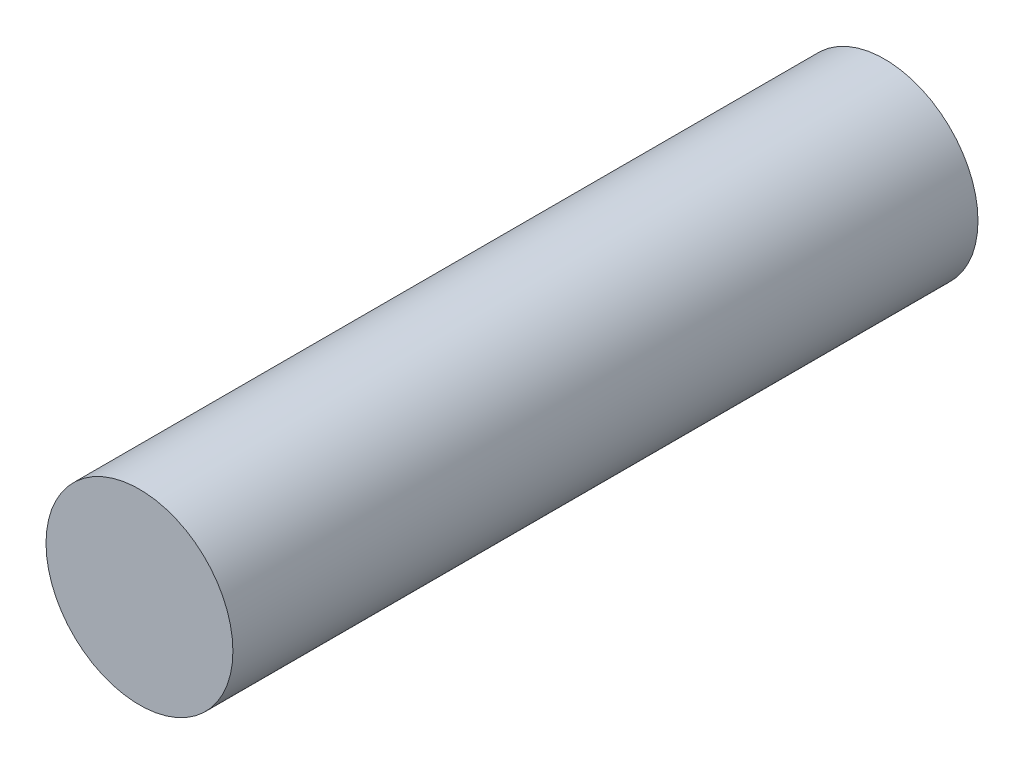
ISO-10303-21;
HEADER;
FILE_DESCRIPTION(('STEP AP214'),'2;1');
FILE_NAME('part.step','',(''),(''),'','','');
FILE_SCHEMA(('AUTOMOTIVE_DESIGN { 1 0 10303 214 1 1 1 1 }'));
ENDSEC;
DATA;
#1=APPLICATION_CONTEXT('core data for automotive mechanical design processes');
#2=APPLICATION_PROTOCOL_DEFINITION('international standard','automotive_design',2000,#1);
#3=PRODUCT_CONTEXT('',#1,'mechanical');
#4=PRODUCT('Part','Part','',(#3));
#5=PRODUCT_RELATED_PRODUCT_CATEGORY('part','',(#4));
#6=PRODUCT_DEFINITION_FORMATION('','',#4);
#7=PRODUCT_DEFINITION_CONTEXT('part definition',#1,'design');
#8=PRODUCT_DEFINITION('design','',#6,#7);
#9=PRODUCT_DEFINITION_SHAPE('','',#8);
#10=(LENGTH_UNIT() NAMED_UNIT(*) SI_UNIT(.MILLI.,.METRE.));
#11=(NAMED_UNIT(*) PLANE_ANGLE_UNIT() SI_UNIT($,.RADIAN.));
#12=(NAMED_UNIT(*) SI_UNIT($,.STERADIAN.) SOLID_ANGLE_UNIT());
#13=UNCERTAINTY_MEASURE_WITH_UNIT(LENGTH_MEASURE(1.E-05),#10,'distance_accuracy_value','');
#14=(GEOMETRIC_REPRESENTATION_CONTEXT(3) GLOBAL_UNCERTAINTY_ASSIGNED_CONTEXT((#13)) GLOBAL_UNIT_ASSIGNED_CONTEXT((#10,
#11,#12)) REPRESENTATION_CONTEXT('',''));
#15=CARTESIAN_POINT('',(0.,0.,0.));
#16=DIRECTION('',(0.,0.,1.));
#17=DIRECTION('',(1.,0.,0.));
#18=AXIS2_PLACEMENT_3D('',#15,#16,#17);
#19=CARTESIAN_POINT('',(0.,52.2816256375904,-51.6160441765637));
#20=DIRECTION('',(0.,0.,1.));
#21=DIRECTION('',(1.,0.,0.));
#22=AXIS2_PLACEMENT_3D('',#19,#20,#21);
#23=CYLINDRICAL_SURFACE('',#22,4.77864324603258);
#24=CARTESIAN_POINT('',(0.,52.2816256375904,-38.1));
#25=DIRECTION('',(0.,0.,1.));
#26=DIRECTION('',(1.,0.,0.));
#27=AXIS2_PLACEMENT_3D('',#24,#25,#26);
#28=CIRCLE('',#27,4.77864324603258);
#29=CARTESIAN_POINT('',(4.77864324603258,52.2816256375904,-38.1));
#30=VERTEX_POINT('',#29);
#31=EDGE_CURVE('E10',#30,#30,#28,.F.);
#32=ORIENTED_EDGE('',*,*,#31,.F.);
#33=EDGE_LOOP('',(#32));
#34=FACE_BOUND('',#33,.T.);
#35=CARTESIAN_POINT('',(0.,52.2816256375904,0.));
#36=DIRECTION('',(0.,0.,1.));
#37=DIRECTION('',(1.,0.,0.));
#38=AXIS2_PLACEMENT_3D('',#35,#36,#37);
#39=CIRCLE('',#38,4.77864324603258);
#40=CARTESIAN_POINT('',(4.77864324603258,52.2816256375904,0.));
#41=VERTEX_POINT('',#40);
#42=EDGE_CURVE('E37',#41,#41,#39,.T.);
#43=ORIENTED_EDGE('',*,*,#42,.F.);
#44=EDGE_LOOP('',(#43));
#45=FACE_BOUND('',#44,.T.);
#46=ADVANCED_FACE('F31',(#34,#45),#23,.T.);
#47=CARTESIAN_POINT('',(0.,52.2816256375904,0.));
#48=DIRECTION('',(0.,0.,1.));
#49=DIRECTION('',(1.,0.,0.));
#50=AXIS2_PLACEMENT_3D('',#47,#48,#49);
#51=PLANE('',#50);
#52=ORIENTED_EDGE('',*,*,#42,.T.);
#53=EDGE_LOOP('',(#52));
#54=FACE_BOUND('',#53,.T.);
#55=ADVANCED_FACE('F43',(#54),#51,.T.);
#56=CARTESIAN_POINT('',(0.,0.,-38.1));
#57=DIRECTION('',(0.,0.,1.));
#58=DIRECTION('',(1.,0.,0.));
#59=AXIS2_PLACEMENT_3D('',#56,#57,#58);
#60=PLANE('',#59);
#61=ORIENTED_EDGE('',*,*,#31,.T.);
#62=EDGE_LOOP('',(#61));
#63=FACE_BOUND('',#62,.T.);
#64=ADVANCED_FACE('F50',(#63),#60,.F.);
#65=CLOSED_SHELL('',(#46,#55,#64));
#66=MANIFOLD_SOLID_BREP('B2',#65);
#67=ADVANCED_BREP_SHAPE_REPRESENTATION('',(#18,#66),#14);
#68=SHAPE_DEFINITION_REPRESENTATION(#9,#67);
ENDSEC;
END-ISO-10303-21;
